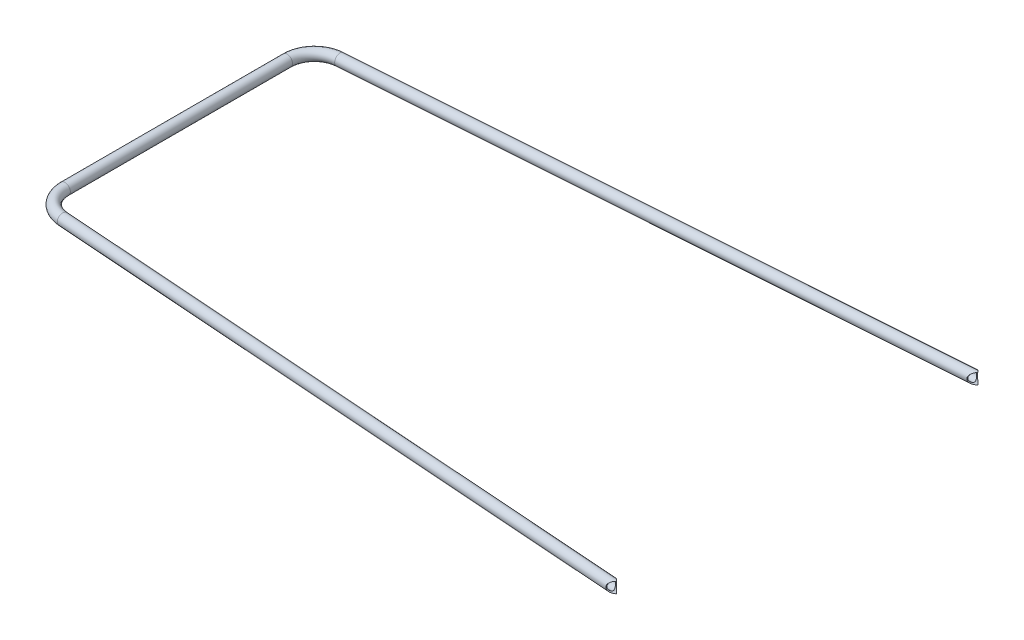
ISO-10303-21;
HEADER;
FILE_DESCRIPTION(('STEP AP214'),'2;1');
FILE_NAME('part.step','',(''),(''),'','','');
FILE_SCHEMA(('AUTOMOTIVE_DESIGN { 1 0 10303 214 1 1 1 1 }'));
ENDSEC;
DATA;
#1=APPLICATION_CONTEXT('core data for automotive mechanical design processes');
#2=APPLICATION_PROTOCOL_DEFINITION('international standard','automotive_design',2000,#1);
#3=PRODUCT_CONTEXT('',#1,'mechanical');
#4=PRODUCT('Part','Part','',(#3));
#5=PRODUCT_RELATED_PRODUCT_CATEGORY('part','',(#4));
#6=PRODUCT_DEFINITION_FORMATION('','',#4);
#7=PRODUCT_DEFINITION_CONTEXT('part definition',#1,'design');
#8=PRODUCT_DEFINITION('design','',#6,#7);
#9=PRODUCT_DEFINITION_SHAPE('','',#8);
#10=(LENGTH_UNIT() NAMED_UNIT(*) SI_UNIT(.MILLI.,.METRE.));
#11=(NAMED_UNIT(*) PLANE_ANGLE_UNIT() SI_UNIT($,.RADIAN.));
#12=(NAMED_UNIT(*) SI_UNIT($,.STERADIAN.) SOLID_ANGLE_UNIT());
#13=UNCERTAINTY_MEASURE_WITH_UNIT(LENGTH_MEASURE(1.E-05),#10,'distance_accuracy_value','');
#14=(GEOMETRIC_REPRESENTATION_CONTEXT(3) GLOBAL_UNCERTAINTY_ASSIGNED_CONTEXT((#13)) GLOBAL_UNIT_ASSIGNED_CONTEXT((#10,
#11,#12)) REPRESENTATION_CONTEXT('',''));
#15=CARTESIAN_POINT('',(0.,0.,0.));
#16=DIRECTION('',(0.,0.,1.));
#17=DIRECTION('',(1.,0.,0.));
#18=AXIS2_PLACEMENT_3D('',#15,#16,#17);
#19=CARTESIAN_POINT('',(37.150118000483,-3.03486438124222E-11,-202.653579857177));
#20=DIRECTION('',(0.997458699830736,0.,-0.0712470499879102));
#21=DIRECTION('',(-0.0712470499879102,0.,-0.997458699830736));
#22=AXIS2_PLACEMENT_3D('',#19,#20,#21);
#23=CYLINDRICAL_SURFACE('',#22,6.4375);
#24=CARTESIAN_POINT('',(902.062500000001,3.02324336860683E-11,-270.886937014753));
#25=CARTESIAN_POINT('',(902.062500072093,-0.157505178977726,-270.886936946997));
#26=CARTESIAN_POINT('',(902.067197131898,-0.315011322752131,-270.881468840321));
#27=CARTESIAN_POINT('',(902.085878644689,-0.628714091415458,-270.859688687306));
#28=CARTESIAN_POINT('',(902.099863208558,-0.784910700647427,-270.8433765115));
#29=CARTESIAN_POINT('',(902.136815761292,-1.09480606592514,-270.800167107787));
#30=CARTESIAN_POINT('',(902.15978699032,-1.24850390019056,-270.77326606202));
#31=CARTESIAN_POINT('',(902.214223198748,-1.5522223321391,-270.709293321239));
#32=CARTESIAN_POINT('',(902.245688270157,-1.70224288996958,-270.672221516053));
#33=CARTESIAN_POINT('',(902.31629901269,-1.99686363153447,-270.588645555399));
#34=CARTESIAN_POINT('',(902.355402872149,-2.14148843449494,-270.542192703229));
#35=CARTESIAN_POINT('',(902.440681711303,-2.42541215933582,-270.440300229725));
#36=CARTESIAN_POINT('',(902.486859477804,-2.56470895507041,-270.384857066099));
#37=CARTESIAN_POINT('',(902.634815711373,-2.97350977059825,-270.205967447341));
#38=CARTESIAN_POINT('',(902.746084696232,-3.23419722739244,-270.069882017558));
#39=CARTESIAN_POINT('',(902.997943955204,-3.75032380606122,-269.75524982281));
#40=CARTESIAN_POINT('',(903.140260781279,-4.00324001937486,-269.574005151556));
#41=CARTESIAN_POINT('',(903.43868339248,-4.47560927220908,-269.180930907685));
#42=CARTESIAN_POINT('',(903.594811046127,-4.69500768478237,-268.969052479464));
#43=CARTESIAN_POINT('',(903.848284175877,-5.01838881297674,-268.607237774687));
#44=CARTESIAN_POINT('',(903.944306637627,-5.1335650734022,-268.466189853585));
#45=CARTESIAN_POINT('',(904.135627858346,-5.3510743274456,-268.173895380536));
#46=CARTESIAN_POINT('',(904.230926339232,-5.45340259937063,-268.022645110389));
#47=CARTESIAN_POINT('',(904.417879996596,-5.64461647763952,-267.710020977684));
#48=CARTESIAN_POINT('',(904.509539428768,-5.73351814883801,-267.548659545617));
#49=CARTESIAN_POINT('',(904.685811037736,-5.89726744378057,-267.215464075232));
#50=CARTESIAN_POINT('',(904.770428312403,-5.9721252840715,-267.043637771341));
#51=CARTESIAN_POINT('',(904.943127459805,-6.11940307249689,-266.655762447322));
#52=CARTESIAN_POINT('',(905.028906290747,-6.18875813636219,-266.437446651094));
#53=CARTESIAN_POINT('',(905.138596517706,-6.27477829828204,-266.099552746765));
#54=CARTESIAN_POINT('',(905.171979496112,-6.30043746219807,-265.985271784427));
#55=CARTESIAN_POINT('',(905.23127005411,-6.34543165854436,-265.753592136232));
#56=CARTESIAN_POINT('',(905.257181581405,-6.3647700314268,-265.636195132746));
#57=CARTESIAN_POINT('',(905.300728381133,-6.39699164129169,-265.397549449936));
#58=CARTESIAN_POINT('',(905.318263934704,-6.40979721948817,-265.276271859266));
#59=CARTESIAN_POINT('',(905.343820419948,-6.42838631357086,-265.032182018241));
#60=CARTESIAN_POINT('',(905.351842094714,-6.43417037788063,-264.9093698885));
#61=CARTESIAN_POINT('',(905.358079891033,-6.43867217874907,-264.663343032984));
#62=CARTESIAN_POINT('',(905.356293933094,-6.43738841673078,-264.540128227367));
#63=CARTESIAN_POINT('',(905.343179388199,-6.42790709167013,-264.294478629085));
#64=CARTESIAN_POINT('',(905.33184962671,-6.41970867765838,-264.172043934296));
#65=CARTESIAN_POINT('',(905.29889917893,-6.39562433291054,-263.917427174118));
#66=CARTESIAN_POINT('',(905.276404623253,-6.37908322165822,-263.785421566653));
#67=CARTESIAN_POINT('',(905.222247024018,-6.33862115017849,-263.524403941276));
#68=CARTESIAN_POINT('',(905.190577479604,-6.31469495652643,-263.395394116254));
#69=CARTESIAN_POINT('',(905.1195382951,-6.25995289875943,-263.140674819758));
#70=CARTESIAN_POINT('',(905.08014943036,-6.2291198052937,-263.014974495717));
#71=CARTESIAN_POINT('',(904.995235213742,-6.16110356002377,-262.767495087909));
#72=CARTESIAN_POINT('',(904.949711158742,-6.12392174979263,-262.645715182151));
#73=CARTESIAN_POINT('',(904.826769774327,-6.02089240918181,-262.338337775821));
#74=CARTESIAN_POINT('',(904.745869401085,-5.95072100585987,-262.155574526596));
#75=CARTESIAN_POINT('',(904.57654567034,-5.79682363860701,-261.799463230797));
#76=CARTESIAN_POINT('',(904.488118101175,-5.71309006232002,-261.626120545326));
#77=CARTESIAN_POINT('',(904.306881325127,-5.53251295374564,-261.288416189492));
#78=CARTESIAN_POINT('',(904.214065667358,-5.43564970310403,-261.124068559431));
#79=CARTESIAN_POINT('',(904.026806766102,-5.22917771592109,-260.804636663527));
#80=CARTESIAN_POINT('',(903.932363843232,-5.11957146618606,-260.649550599193));
#81=CARTESIAN_POINT('',(903.739634487117,-4.88223079747909,-260.341839641262));
#82=CARTESIAN_POINT('',(903.641373715142,-4.75389013350001,-260.189665125901));
#83=CARTESIAN_POINT('',(903.447685933861,-4.48316807018542,-259.896306287203));
#84=CARTESIAN_POINT('',(903.352259417178,-4.34078424836657,-259.755123867576));
#85=CARTESIAN_POINT('',(903.166656381203,-4.04229358228335,-259.485165375022));
#86=CARTESIAN_POINT('',(903.07646754297,-3.8862213022862,-259.356359682352));
#87=CARTESIAN_POINT('',(902.903267047815,-3.56010550078461,-259.11220284161));
#88=CARTESIAN_POINT('',(902.820254767715,-3.39006319487776,-258.996850525006));
#89=CARTESIAN_POINT('',(902.686590445917,-3.0881520160178,-258.812945573091));
#90=CARTESIAN_POINT('',(902.633570573168,-2.95964787407935,-258.740567168604));
#91=CARTESIAN_POINT('',(902.533111020107,-2.69617125758341,-258.604226737008));
#92=CARTESIAN_POINT('',(902.485669873904,-2.56120049540387,-258.540262498425));
#93=CARTESIAN_POINT('',(902.397203956388,-2.28525402007962,-258.421539484548));
#94=CARTESIAN_POINT('',(902.356178019637,-2.14427940357723,-258.366779037085));
#95=CARTESIAN_POINT('',(902.281361594697,-1.8570248721414,-258.267273826564));
#96=CARTESIAN_POINT('',(902.24756810857,-1.71074718491247,-258.222524913255));
#97=CARTESIAN_POINT('',(902.187695751453,-1.41249077982161,-258.143448611352));
#98=CARTESIAN_POINT('',(902.161683203593,-1.2604748347982,-258.109210755318));
#99=CARTESIAN_POINT('',(902.118395442347,-0.953051226030533,-258.052330305459));
#100=CARTESIAN_POINT('',(902.101120219734,-0.797643565868518,-258.029687699387));
#101=CARTESIAN_POINT('',(902.075770963637,-0.484874436754648,-257.996487808059));
#102=CARTESIAN_POINT('',(902.067692136538,-0.327514028954344,-257.985924226607));
#103=CARTESIAN_POINT('',(902.060944279005,-0.0122549682938377,-257.977099772192));
#104=CARTESIAN_POINT('',(902.062274243872,0.145643625297541,-257.97883758565));
#105=CARTESIAN_POINT('',(902.073572926361,0.441415969220081,-257.993617136684));
#106=CARTESIAN_POINT('',(902.082478048325,0.579403295054776,-258.005267181034));
#107=CARTESIAN_POINT('',(902.10733867743,0.853680734847052,-258.037840321294));
#108=CARTESIAN_POINT('',(902.12329648704,0.989970279583004,-258.058766445544));
#109=CARTESIAN_POINT('',(902.161936879375,1.25985963873153,-258.109548511569));
#110=CARTESIAN_POINT('',(902.184617478237,1.39346023423718,-258.139401818998));
#111=CARTESIAN_POINT('',(902.236269826138,1.65725650805904,-258.2075886565));
#112=CARTESIAN_POINT('',(902.265243982868,1.7874508618512,-258.245925432153));
#113=CARTESIAN_POINT('',(902.362059548842,2.17669029720233,-258.374489241646));
#114=CARTESIAN_POINT('',(902.439061139621,2.42943144076257,-258.477316885249));
#115=CARTESIAN_POINT('',(902.612292381271,2.91412482942562,-258.711324696317));
#116=CARTESIAN_POINT('',(902.708530320373,3.14606805085528,-258.842517087098));
#117=CARTESIAN_POINT('',(902.889109368601,3.53161369569278,-259.092586963007));
#118=CARTESIAN_POINT('',(902.9703010468,3.69019069884707,-259.206183750008));
#119=CARTESIAN_POINT('',(903.138733987878,3.99464614604419,-259.445285580599));
#120=CARTESIAN_POINT('',(903.225975716248,4.14052361103057,-259.570791540758));
#121=CARTESIAN_POINT('',(903.404865105177,4.41992077583002,-259.832884980807));
#122=CARTESIAN_POINT('',(903.496524646693,4.55340396084735,-259.96950311026));
#123=CARTESIAN_POINT('',(903.682118243183,4.80760169346143,-260.252639779925));
#124=CARTESIAN_POINT('',(903.776051979434,4.92831801771885,-260.399156937906));
#125=CARTESIAN_POINT('',(903.966165281202,5.15941692616399,-260.704701735152));
#126=CARTESIAN_POINT('',(904.062351287917,5.26953577455749,-260.863924759221));
#127=CARTESIAN_POINT('',(904.25271300446,5.47652873853531,-261.191986047353));
#128=CARTESIAN_POINT('',(904.346888112847,5.57339893713025,-261.360827134205));
#129=CARTESIAN_POINT('',(904.530159323182,5.75336368066276,-261.707800203518));
#130=CARTESIAN_POINT('',(904.619266262505,5.83648840491534,-261.885910671806));
#131=CARTESIAN_POINT('',(904.788958281064,5.98848168775112,-262.251847665565));
#132=CARTESIAN_POINT('',(904.869549626292,6.05736076488375,-262.439666893377));
#133=CARTESIAN_POINT('',(905.028537632243,6.18874807456026,-262.853813518141));
#134=CARTESIAN_POINT('',(905.104883605052,6.24884519793685,-263.081751661891));
#135=CARTESIAN_POINT('',(905.199695926111,6.32159674980957,-263.432347362885));
#136=CARTESIAN_POINT('',(905.228005284465,6.34294117806163,-263.550592289575));
#137=CARTESIAN_POINT('',(905.276900483263,6.37943322813371,-263.789584511008));
#138=CARTESIAN_POINT('',(905.297490415344,6.39458413318057,-263.910330444188));
#139=CARTESIAN_POINT('',(905.330101274321,6.41844001035753,-264.155236617152));
#140=CARTESIAN_POINT('',(905.342007564294,6.42705880504458,-264.279420829532));
#141=CARTESIAN_POINT('',(905.356010994116,6.43718490721579,-264.528637698736));
#142=CARTESIAN_POINT('',(905.358108814758,6.43869270826602,-264.653670296071));
#143=CARTESIAN_POINT('',(905.352197566387,6.4344272503423,-264.903357840383));
#144=CARTESIAN_POINT('',(905.344190205921,6.42865522221571,-265.02801284763));
#145=CARTESIAN_POINT('',(905.318386946074,6.40988673537063,-265.27572317601));
#146=CARTESIAN_POINT('',(905.300591012796,6.39689025163331,-265.398778491602));
#147=CARTESIAN_POINT('',(905.239664819645,6.35180834522901,-265.731351742041));
#148=CARTESIAN_POINT('',(905.187524583498,6.31271372696505,-265.938322852191));
#149=CARTESIAN_POINT('',(905.062543495132,6.21543267475606,-266.341178209147));
#150=CARTESIAN_POINT('',(904.989675392838,6.15722109285492,-266.53704745155));
#151=CARTESIAN_POINT('',(904.841386492844,6.03328917054349,-266.889370426286));
#152=CARTESIAN_POINT('',(904.767837295195,5.96984996619212,-267.047443475123));
#153=CARTESIAN_POINT('',(904.613827205419,5.83127609181235,-267.35494190731));
#154=CARTESIAN_POINT('',(904.533362052898,5.75613418916418,-267.504361863915));
#155=CARTESIAN_POINT('',(904.368184949671,5.59463521911482,-267.795022089262));
#156=CARTESIAN_POINT('',(904.283464236468,5.50825437575812,-267.936244072318));
#157=CARTESIAN_POINT('',(904.11221745274,5.32481635921765,-268.21034694926));
#158=CARTESIAN_POINT('',(904.025691724998,5.22776119847084,-268.343229408008));
#159=CARTESIAN_POINT('',(903.848923343142,5.0187357480292,-268.606364610143));
#160=CARTESIAN_POINT('',(903.758683422212,4.9062991370952,-268.736248946498));
#161=CARTESIAN_POINT('',(903.580103297694,4.6701983063791,-268.986902080791));
#162=CARTESIAN_POINT('',(903.491763721339,4.54653044782308,-269.107667901077));
#163=CARTESIAN_POINT('',(903.318829678179,4.2883537376251,-269.339478071192));
#164=CARTESIAN_POINT('',(903.234230043522,4.1538606190245,-269.450536056952));
#165=CARTESIAN_POINT('',(903.070257306549,3.87412532139261,-269.662495938915));
#166=CARTESIAN_POINT('',(902.990883223543,3.72888517020898,-269.763399742665));
#167=CARTESIAN_POINT('',(902.848676797627,3.44732767767236,-269.94200240948));
#168=CARTESIAN_POINT('',(902.785028785584,3.3122568262088,-270.021017452195));
#169=CARTESIAN_POINT('',(902.66394037484,3.03464214223892,-270.170060207134));
#170=CARTESIAN_POINT('',(902.606497348822,2.89210151085926,-270.240091725539));
#171=CARTESIAN_POINT('',(902.498821915079,2.60008482870335,-270.37047717185));
#172=CARTESIAN_POINT('',(902.448587149117,2.45061106742852,-270.430834265579));
#173=CARTESIAN_POINT('',(902.356280063154,2.14542685291231,-270.541163252044));
#174=CARTESIAN_POINT('',(902.314207154956,1.98971685007269,-270.591135893173));
#175=CARTESIAN_POINT('',(902.24195585326,1.68501785816856,-270.676624262355));
#176=CARTESIAN_POINT('',(902.211118265614,1.53641201022404,-270.712947858543));
#177=CARTESIAN_POINT('',(902.157781242092,1.23564902847202,-270.775616952843));
#178=CARTESIAN_POINT('',(902.135280686807,1.08349237434792,-270.80196379054));
#179=CARTESIAN_POINT('',(902.099088076839,0.776748667788487,-270.844281089987));
#180=CARTESIAN_POINT('',(902.085393335105,0.622162371510732,-270.860254717085));
#181=CARTESIAN_POINT('',(902.067099195506,0.311717710596555,-270.881582789479));
#182=CARTESIAN_POINT('',(902.062499928663,0.155859327667956,-270.886937081802));
#183=CARTESIAN_POINT('',(902.062500000001,3.02324336860683E-11,-270.886937014753));
#184=B_SPLINE_CURVE_WITH_KNOTS('',3,(#24,#25,#26,#27,#28,#29,#30,#31,#32,#33,#34,#35,#36,#37,
#38,#39,#40,#41,#42,#43,#44,#45,#46,#47,#48,#49,#50,#51,#52,#53,#54,#55,#56,#57,#58,#59,#60,#61,
#62,#63,#64,#65,#66,#67,#68,#69,#70,#71,#72,#73,#74,#75,#76,#77,#78,#79,#80,#81,#82,#83,#84,#85,
#86,#87,#88,#89,#90,#91,#92,#93,#94,#95,#96,#97,#98,#99,#100,#101,#102,#103,#104,#105,#106,#107,
#108,#109,#110,#111,#112,#113,#114,#115,#116,#117,#118,#119,#120,#121,#122,#123,#124,#125,#126,
#127,#128,#129,#130,#131,#132,#133,#134,#135,#136,#137,#138,#139,#140,#141,#142,#143,#144,#145,
#146,#147,#148,#149,#150,#151,#152,#153,#154,#155,#156,#157,#158,#159,#160,#161,#162,#163,#164,
#165,#166,#167,#168,#169,#170,#171,#172,#173,#174,#175,#176,#177,#178,#179,#180,#181,#182,#183),
.UNSPECIFIED.,.T.,.F.,(4,2,2,2,2,2,2,2,2,2,2,2,2,2,2,2,2,2,2,2,2,2,2,2,2,2,2,2,2,2,2,2,2,2,2,2,
2,2,2,2,2,2,2,2,2,2,2,2,2,2,2,2,2,2,2,2,2,2,2,2,2,2,2,2,2,2,2,2,2,2,2,2,2,2,2,2,2,2,2,4),(0.,
0.472353873402621,0.94471338629413,1.41724336661991,1.88977846574643,2.35979612115191,
2.82999942123645,3.76953941845855,4.79253282221384,5.81717610000756,6.43421363532453,
7.05147727503858,7.66799640920811,8.28406528658488,9.01516270292666,9.38017995145539,
9.74500398023915,10.114069322494,10.4831058366133,10.8522205998137,11.2213807956988,
11.625542398541,12.0299910698621,12.4354601063325,12.8408435672973,13.475356558786,
14.1102269402683,14.7460615681093,15.3817723199477,16.0470661657624,16.7124749779892,
17.3762494689402,18.039966262805,18.5097379255396,18.9793858717222,19.4489483985715,
19.9183159074789,20.3915771130107,20.8648378187212,21.3378517245098,21.8108151212144,
22.226611463077,22.6425436490291,23.0583532173595,23.4743221407,24.3214007464564,
25.168845116839,25.8019036870619,26.4350110190748,27.0699279998968,27.7047565078763,
28.352647283495,29.0007291971197,29.6473687373581,30.2935291006362,31.0343393133877,
31.4043318072023,31.7741279104543,32.1487216206454,32.5232893303264,32.8977937179341,
33.2722994024867,33.9205488538693,34.5696545024417,35.1254816249586,35.6816536386219,
36.2390219682148,36.796285396292,37.3778904426906,37.959684598177,38.5406479556774,
39.1215019699106,39.6278220823535,40.1339269612021,40.6398658845417,41.145768332981,
41.6133851574944,42.0809391725534,42.5483504480505,43.0157684566475),.UNSPECIFIED.);
#185=CARTESIAN_POINT('',(902.062500000001,3.02324336860683E-11,-270.886937014753));
#186=VERTEX_POINT('',#185);
#187=EDGE_CURVE('E75',#186,#186,#184,.T.);
#188=ORIENTED_EDGE('',*,*,#187,.F.);
#189=EDGE_LOOP('',(#188));
#190=FACE_BOUND('',#189,.T.);
#191=CARTESIAN_POINT('',(37.1501180004829,-3.03486389684526E-11,-202.653579857177));
#192=DIRECTION('',(-0.997458699830736,0.,0.0712470499879106));
#193=DIRECTION('',(0.0712470499879107,0.,0.997458699830736));
#194=AXIS2_PLACEMENT_3D('',#191,#192,#193);
#195=CIRCLE('',#194,6.4375);
#196=CARTESIAN_POINT('',(37.6087708847801,-3.03486389684526E-11,-196.232439477017));
#197=VERTEX_POINT('',#196);
#198=EDGE_CURVE('E57',#197,#197,#195,.T.);
#199=ORIENTED_EDGE('',*,*,#198,.T.);
#200=EDGE_LOOP('',(#199));
#201=FACE_BOUND('',#200,.T.);
#202=ADVANCED_FACE('F53',(#190,#201),#23,.F.);
#203=CARTESIAN_POINT('',(37.150118000483,-3.03486438124222E-11,-202.653579857177));
#204=DIRECTION('',(0.997458699830736,0.,-0.0712470499879102));
#205=DIRECTION('',(-0.0712470499879102,0.,-0.997458699830736));
#206=AXIS2_PLACEMENT_3D('',#203,#204,#205);
#207=CYLINDRICAL_SURFACE('',#206,7.9375);
#208=CARTESIAN_POINT('',(910.000000000001,3.07559559516459E-11,-265.));
#209=DIRECTION('',(0.681451740775563,0.,-0.731863050709596));
#210=DIRECTION('',(0.731863050709595,0.,0.681451740775563));
#211=AXIS2_PLACEMENT_3D('',#208,#209,#210);
#212=ELLIPSE('',#211,10.8456083310997,7.93749999999999);
#213=CARTESIAN_POINT('',(910.,7.93750000003074,-265.));
#214=VERTEX_POINT('',#213);
#215=CARTESIAN_POINT('',(910.000000000001,-7.93749999996924,-265.));
#216=VERTEX_POINT('',#215);
#217=EDGE_CURVE('E69',#214,#216,#212,.F.);
#218=ORIENTED_EDGE('',*,*,#217,.T.);
#219=CARTESIAN_POINT('',(910.000000000001,3.07559559516459E-11,-265.));
#220=DIRECTION('',(0.731863050709595,0.,0.681451740775563));
#221=DIRECTION('',(0.681451740775563,0.,-0.731863050709596));
#222=AXIS2_PLACEMENT_3D('',#219,#220,#221);
#223=ELLIPSE('',#222,11.6479268083845,7.93749999999999);
#224=EDGE_CURVE('E67',#216,#214,#223,.F.);
#225=ORIENTED_EDGE('',*,*,#224,.T.);
#226=EDGE_LOOP('',(#218,#225));
#227=FACE_BOUND('',#226,.T.);
#228=CARTESIAN_POINT('',(37.1501180004829,-3.03486389684526E-11,-202.653579857177));
#229=DIRECTION('',(-0.997458699830736,0.,0.0712470499879106));
#230=DIRECTION('',(0.0712470499879107,0.,0.997458699830736));
#231=AXIS2_PLACEMENT_3D('',#228,#229,#230);
#232=CIRCLE('',#231,7.9375);
#233=CARTESIAN_POINT('',(37.7156414597619,-3.03486389684526E-11,-194.736251427271));
#234=VERTEX_POINT('',#233);
#235=EDGE_CURVE('E13',#234,#234,#232,.T.);
#236=ORIENTED_EDGE('',*,*,#235,.F.);
#237=EDGE_LOOP('',(#236));
#238=FACE_BOUND('',#237,.T.);
#239=ADVANCED_FACE('F73',(#227,#238),#207,.T.);
#240=CARTESIAN_POINT('',(37.1501180004829,-3.03486389684526E-11,-202.653579857177));
#241=DIRECTION('',(-0.997458699830736,0.,0.0712470499879106));
#242=DIRECTION('',(0.0712470499879107,0.,0.997458699830736));
#243=AXIS2_PLACEMENT_3D('',#240,#241,#242);
#244=PLANE('',#243);
#245=ORIENTED_EDGE('',*,*,#198,.F.);
#246=EDGE_LOOP('',(#245));
#247=FACE_BOUND('',#246,.T.);
#248=ORIENTED_EDGE('',*,*,#235,.T.);
#249=EDGE_LOOP('',(#248));
#250=FACE_BOUND('',#249,.T.);
#251=ADVANCED_FACE('F55',(#247,#250),#244,.T.);
#252=CARTESIAN_POINT('',(910.,3.0795331125232E-11,-272.917328429907));
#253=DIRECTION('',(0.,0.,1.));
#254=DIRECTION('',(1.,0.,0.));
#255=AXIS2_PLACEMENT_3D('',#252,#253,#254);
#256=CYLINDRICAL_SURFACE('',#255,7.93749999999998);
#257=ORIENTED_EDGE('',*,*,#187,.T.);
#258=EDGE_LOOP('',(#257));
#259=FACE_BOUND('',#258,.T.);
#260=ORIENTED_EDGE('',*,*,#217,.F.);
#261=ORIENTED_EDGE('',*,*,#224,.F.);
#262=EDGE_LOOP('',(#260,#261));
#263=FACE_BOUND('',#262,.T.);
#264=ADVANCED_FACE('F70',(#259,#263),#256,.F.);
#265=CLOSED_SHELL('',(#202,#239,#251,#264));
#266=MANIFOLD_SOLID_BREP('B2',#265);
#267=CARTESIAN_POINT('',(40.,0.,-162.755231863948));
#268=DIRECTION('',(0.,-1.,0.));
#269=DIRECTION('',(0.,0.,-1.));
#270=AXIS2_PLACEMENT_3D('',#267,#268,#269);
#271=TOROIDAL_SURFACE('',#270,40.,6.4375);
#272=CARTESIAN_POINT('',(0.,0.,-162.755231863948));
#273=DIRECTION('',(0.,0.,1.));
#274=DIRECTION('',(1.,0.,0.));
#275=AXIS2_PLACEMENT_3D('',#272,#273,#274);
#276=CIRCLE('',#275,6.4375);
#277=CARTESIAN_POINT('',(-6.43749999999997,0.,-162.755231863948));
#278=VERTEX_POINT('',#277);
#279=EDGE_CURVE('E160',#278,#278,#276,.T.);
#280=CARTESIAN_POINT('',(37.1501180004836,0.,-202.653579857177));
#281=DIRECTION('',(0.997458699830736,0.,-0.07124704998791));
#282=DIRECTION('',(-0.07124704998791,0.,-0.997458699830736));
#283=AXIS2_PLACEMENT_3D('',#280,#281,#282);
#284=CIRCLE('',#283,6.4375);
#285=CARTESIAN_POINT('',(36.6914651161865,0.,-209.074720237338));
#286=VERTEX_POINT('',#285);
#287=EDGE_CURVE('E150',#286,#286,#284,.T.);
#288=CARTESIAN_POINT('',(40.,0.,-162.755231863948));
#289=DIRECTION('',(0.,-1.,0.));
#290=DIRECTION('',(0.,0.,-1.));
#291=AXIS2_PLACEMENT_3D('',#288,#289,#290);
#292=CIRCLE('',#291,46.4375);
#293=EDGE_CURVE('',#278,#286,#292,.T.);
#294=ORIENTED_EDGE('',*,*,#279,.T.);
#295=ORIENTED_EDGE('',*,*,#287,.T.);
#296=ORIENTED_EDGE('',*,*,#293,.T.);
#297=ORIENTED_EDGE('',*,*,#293,.F.);
#298=EDGE_LOOP('',(#294,#296,#295,#297));
#299=FACE_BOUND('',#298,.T.);
#300=ADVANCED_FACE('F146',(#299),#271,.F.);
#301=CARTESIAN_POINT('',(40.,0.,-162.755231863948));
#302=DIRECTION('',(0.,-1.,0.));
#303=DIRECTION('',(0.,0.,-1.));
#304=AXIS2_PLACEMENT_3D('',#301,#302,#303);
#305=TOROIDAL_SURFACE('',#304,40.,7.9375);
#306=CARTESIAN_POINT('',(0.,0.,-162.755231863948));
#307=DIRECTION('',(0.,0.,1.));
#308=DIRECTION('',(1.,0.,0.));
#309=AXIS2_PLACEMENT_3D('',#306,#307,#308);
#310=CIRCLE('',#309,7.9375);
#311=CARTESIAN_POINT('',(-7.93749999999997,0.,-162.755231863948));
#312=VERTEX_POINT('',#311);
#313=EDGE_CURVE('E154',#312,#312,#310,.T.);
#314=CARTESIAN_POINT('',(37.1501180004836,0.,-202.653579857177));
#315=DIRECTION('',(0.997458699830736,0.,-0.07124704998791));
#316=DIRECTION('',(-0.07124704998791,0.,-0.997458699830736));
#317=AXIS2_PLACEMENT_3D('',#314,#315,#316);
#318=CIRCLE('',#317,7.9375);
#319=CARTESIAN_POINT('',(36.5845945412046,0.,-210.570908287084));
#320=VERTEX_POINT('',#319);
#321=EDGE_CURVE('E52',#320,#320,#318,.T.);
#322=CARTESIAN_POINT('',(40.,0.,-162.755231863948));
#323=DIRECTION('',(0.,-1.,0.));
#324=DIRECTION('',(0.,0.,-1.));
#325=AXIS2_PLACEMENT_3D('',#322,#323,#324);
#326=CIRCLE('',#325,47.9375);
#327=EDGE_CURVE('',#312,#320,#326,.T.);
#328=ORIENTED_EDGE('',*,*,#313,.F.);
#329=ORIENTED_EDGE('',*,*,#321,.F.);
#330=ORIENTED_EDGE('',*,*,#327,.T.);
#331=ORIENTED_EDGE('',*,*,#327,.F.);
#332=EDGE_LOOP('',(#328,#330,#329,#331));
#333=FACE_BOUND('',#332,.T.);
#334=ADVANCED_FACE('F173',(#333),#305,.T.);
#335=CARTESIAN_POINT('',(0.,0.,-162.755231863948));
#336=DIRECTION('',(0.,0.,1.));
#337=DIRECTION('',(1.,0.,0.));
#338=AXIS2_PLACEMENT_3D('',#335,#336,#337);
#339=PLANE('',#338);
#340=ORIENTED_EDGE('',*,*,#279,.F.);
#341=EDGE_LOOP('',(#340));
#342=FACE_BOUND('',#341,.T.);
#343=ORIENTED_EDGE('',*,*,#313,.T.);
#344=EDGE_LOOP('',(#343));
#345=FACE_BOUND('',#344,.T.);
#346=ADVANCED_FACE('F169',(#342,#345),#339,.T.);
#347=CARTESIAN_POINT('',(37.1501180004837,0.,-202.653579857177));
#348=DIRECTION('',(0.997458699830736,0.,-0.07124704998791));
#349=DIRECTION('',(-0.07124704998791,0.,-0.997458699830736));
#350=AXIS2_PLACEMENT_3D('',#347,#348,#349);
#351=PLANE('',#350);
#352=ORIENTED_EDGE('',*,*,#287,.F.);
#353=EDGE_LOOP('',(#352));
#354=FACE_BOUND('',#353,.T.);
#355=ORIENTED_EDGE('',*,*,#321,.T.);
#356=EDGE_LOOP('',(#355));
#357=FACE_BOUND('',#356,.T.);
#358=ADVANCED_FACE('F148',(#354,#357),#351,.T.);
#359=CLOSED_SHELL('',(#300,#334,#346,#358));
#360=MANIFOLD_SOLID_BREP('B7',#359);
#361=CARTESIAN_POINT('',(0.,0.,162.755231863948));
#362=DIRECTION('',(0.,0.,-1.));
#363=DIRECTION('',(-1.,0.,0.));
#364=AXIS2_PLACEMENT_3D('',#361,#362,#363);
#365=CYLINDRICAL_SURFACE('',#364,6.4375);
#366=CARTESIAN_POINT('',(0.,0.,162.755231863948));
#367=DIRECTION('',(0.,0.,1.));
#368=DIRECTION('',(1.,0.,0.));
#369=AXIS2_PLACEMENT_3D('',#366,#367,#368);
#370=CIRCLE('',#369,6.4375);
#371=CARTESIAN_POINT('',(6.43749999999998,0.,162.755231863948));
#372=VERTEX_POINT('',#371);
#373=EDGE_CURVE('E245',#372,#372,#370,.T.);
#374=ORIENTED_EDGE('',*,*,#373,.T.);
#375=EDGE_LOOP('',(#374));
#376=FACE_BOUND('',#375,.T.);
#377=CARTESIAN_POINT('',(0.,0.,-162.755231863948));
#378=DIRECTION('',(0.,0.,-1.));
#379=DIRECTION('',(-1.,0.,0.));
#380=AXIS2_PLACEMENT_3D('',#377,#378,#379);
#381=CIRCLE('',#380,6.4375);
#382=CARTESIAN_POINT('',(-6.43750000000003,0.,-162.755231863948));
#383=VERTEX_POINT('',#382);
#384=EDGE_CURVE('E235',#383,#383,#381,.T.);
#385=ORIENTED_EDGE('',*,*,#384,.T.);
#386=EDGE_LOOP('',(#385));
#387=FACE_BOUND('',#386,.T.);
#388=ADVANCED_FACE('F231',(#376,#387),#365,.F.);
#389=CARTESIAN_POINT('',(0.,0.,162.755231863948));
#390=DIRECTION('',(0.,0.,-1.));
#391=DIRECTION('',(-1.,0.,0.));
#392=AXIS2_PLACEMENT_3D('',#389,#390,#391);
#393=CYLINDRICAL_SURFACE('',#392,7.9375);
#394=CARTESIAN_POINT('',(0.,0.,162.755231863948));
#395=DIRECTION('',(0.,0.,1.));
#396=DIRECTION('',(1.,0.,0.));
#397=AXIS2_PLACEMENT_3D('',#394,#395,#396);
#398=CIRCLE('',#397,7.9375);
#399=CARTESIAN_POINT('',(7.93749999999997,0.,162.755231863948));
#400=VERTEX_POINT('',#399);
#401=EDGE_CURVE('E239',#400,#400,#398,.T.);
#402=ORIENTED_EDGE('',*,*,#401,.F.);
#403=EDGE_LOOP('',(#402));
#404=FACE_BOUND('',#403,.T.);
#405=CARTESIAN_POINT('',(0.,0.,-162.755231863948));
#406=DIRECTION('',(0.,0.,-1.));
#407=DIRECTION('',(-1.,0.,0.));
#408=AXIS2_PLACEMENT_3D('',#405,#406,#407);
#409=CIRCLE('',#408,7.9375);
#410=CARTESIAN_POINT('',(-7.93750000000003,0.,-162.755231863948));
#411=VERTEX_POINT('',#410);
#412=EDGE_CURVE('E145',#411,#411,#409,.T.);
#413=ORIENTED_EDGE('',*,*,#412,.F.);
#414=EDGE_LOOP('',(#413));
#415=FACE_BOUND('',#414,.T.);
#416=ADVANCED_FACE('F258',(#404,#415),#393,.T.);
#417=CARTESIAN_POINT('',(0.,0.,162.755231863948));
#418=DIRECTION('',(0.,0.,1.));
#419=DIRECTION('',(1.,0.,0.));
#420=AXIS2_PLACEMENT_3D('',#417,#418,#419);
#421=PLANE('',#420);
#422=ORIENTED_EDGE('',*,*,#373,.F.);
#423=EDGE_LOOP('',(#422));
#424=FACE_BOUND('',#423,.T.);
#425=ORIENTED_EDGE('',*,*,#401,.T.);
#426=EDGE_LOOP('',(#425));
#427=FACE_BOUND('',#426,.T.);
#428=ADVANCED_FACE('F254',(#424,#427),#421,.T.);
#429=CARTESIAN_POINT('',(0.,0.,-162.755231863948));
#430=DIRECTION('',(0.,0.,-1.));
#431=DIRECTION('',(-1.,0.,0.));
#432=AXIS2_PLACEMENT_3D('',#429,#430,#431);
#433=PLANE('',#432);
#434=ORIENTED_EDGE('',*,*,#384,.F.);
#435=EDGE_LOOP('',(#434));
#436=FACE_BOUND('',#435,.T.);
#437=ORIENTED_EDGE('',*,*,#412,.T.);
#438=EDGE_LOOP('',(#437));
#439=FACE_BOUND('',#438,.T.);
#440=ADVANCED_FACE('F233',(#436,#439),#433,.T.);
#441=CLOSED_SHELL('',(#388,#416,#428,#440));
#442=MANIFOLD_SOLID_BREP('B47',#441);
#443=CARTESIAN_POINT('',(40.0000000000001,0.,162.755231863948));
#444=DIRECTION('',(0.,-1.,0.));
#445=DIRECTION('',(0.,0.,-1.));
#446=AXIS2_PLACEMENT_3D('',#443,#444,#445);
#447=TOROIDAL_SURFACE('',#446,40.,6.4375);
#448=CARTESIAN_POINT('',(37.1501180004837,0.,202.653579857177));
#449=DIRECTION('',(0.997458699830736,0.,0.0712470499879095));
#450=DIRECTION('',(0.0712470499879098,0.,-0.997458699830736));
#451=AXIS2_PLACEMENT_3D('',#448,#449,#450);
#452=CIRCLE('',#451,6.4375);
#453=CARTESIAN_POINT('',(36.6914651161865,0.,209.074720237338));
#454=VERTEX_POINT('',#453);
#455=EDGE_CURVE('E342',#454,#454,#452,.T.);
#456=CARTESIAN_POINT('',(0.,0.,162.755231863948));
#457=DIRECTION('',(0.,0.,-1.));
#458=DIRECTION('',(-1.,0.,0.));
#459=AXIS2_PLACEMENT_3D('',#456,#457,#458);
#460=CIRCLE('',#459,6.4375);
#461=CARTESIAN_POINT('',(-6.43749999999999,0.,162.755231863948));
#462=VERTEX_POINT('',#461);
#463=EDGE_CURVE('E332',#462,#462,#460,.T.);
#464=CARTESIAN_POINT('',(40.0000000000001,0.,162.755231863948));
#465=DIRECTION('',(0.,-1.,0.));
#466=DIRECTION('',(0.,0.,-1.));
#467=AXIS2_PLACEMENT_3D('',#464,#465,#466);
#468=CIRCLE('',#467,46.4375000000001);
#469=EDGE_CURVE('',#454,#462,#468,.T.);
#470=ORIENTED_EDGE('',*,*,#455,.T.);
#471=ORIENTED_EDGE('',*,*,#463,.T.);
#472=ORIENTED_EDGE('',*,*,#469,.T.);
#473=ORIENTED_EDGE('',*,*,#469,.F.);
#474=EDGE_LOOP('',(#470,#472,#471,#473));
#475=FACE_BOUND('',#474,.T.);
#476=ADVANCED_FACE('F328',(#475),#447,.F.);
#477=CARTESIAN_POINT('',(40.0000000000001,0.,162.755231863948));
#478=DIRECTION('',(0.,-1.,0.));
#479=DIRECTION('',(0.,0.,-1.));
#480=AXIS2_PLACEMENT_3D('',#477,#478,#479);
#481=TOROIDAL_SURFACE('',#480,40.,7.9375);
#482=CARTESIAN_POINT('',(37.1501180004837,0.,202.653579857177));
#483=DIRECTION('',(0.997458699830736,0.,0.0712470499879095));
#484=DIRECTION('',(0.0712470499879098,0.,-0.997458699830736));
#485=AXIS2_PLACEMENT_3D('',#482,#483,#484);
#486=CIRCLE('',#485,7.9375);
#487=CARTESIAN_POINT('',(36.5845945412046,0.,210.570908287084));
#488=VERTEX_POINT('',#487);
#489=EDGE_CURVE('E336',#488,#488,#486,.T.);
#490=CARTESIAN_POINT('',(0.,0.,162.755231863948));
#491=DIRECTION('',(0.,0.,-1.));
#492=DIRECTION('',(-1.,0.,0.));
#493=AXIS2_PLACEMENT_3D('',#490,#491,#492);
#494=CIRCLE('',#493,7.9375);
#495=CARTESIAN_POINT('',(-7.93749999999999,0.,162.755231863948));
#496=VERTEX_POINT('',#495);
#497=EDGE_CURVE('E230',#496,#496,#494,.T.);
#498=CARTESIAN_POINT('',(40.0000000000001,0.,162.755231863948));
#499=DIRECTION('',(0.,-1.,0.));
#500=DIRECTION('',(0.,0.,-1.));
#501=AXIS2_PLACEMENT_3D('',#498,#499,#500);
#502=CIRCLE('',#501,47.9375);
#503=EDGE_CURVE('',#488,#496,#502,.T.);
#504=ORIENTED_EDGE('',*,*,#489,.F.);
#505=ORIENTED_EDGE('',*,*,#497,.F.);
#506=ORIENTED_EDGE('',*,*,#503,.T.);
#507=ORIENTED_EDGE('',*,*,#503,.F.);
#508=EDGE_LOOP('',(#504,#506,#505,#507));
#509=FACE_BOUND('',#508,.T.);
#510=ADVANCED_FACE('F355',(#509),#481,.T.);
#511=CARTESIAN_POINT('',(37.1501180004837,0.,202.653579857177));
#512=DIRECTION('',(0.997458699830736,0.,0.0712470499879095));
#513=DIRECTION('',(0.0712470499879098,0.,-0.997458699830736));
#514=AXIS2_PLACEMENT_3D('',#511,#512,#513);
#515=PLANE('',#514);
#516=ORIENTED_EDGE('',*,*,#455,.F.);
#517=EDGE_LOOP('',(#516));
#518=FACE_BOUND('',#517,.T.);
#519=ORIENTED_EDGE('',*,*,#489,.T.);
#520=EDGE_LOOP('',(#519));
#521=FACE_BOUND('',#520,.T.);
#522=ADVANCED_FACE('F351',(#518,#521),#515,.T.);
#523=CARTESIAN_POINT('',(0.,0.,162.755231863948));
#524=DIRECTION('',(0.,0.,-1.));
#525=DIRECTION('',(-1.,0.,0.));
#526=AXIS2_PLACEMENT_3D('',#523,#524,#525);
#527=PLANE('',#526);
#528=ORIENTED_EDGE('',*,*,#463,.F.);
#529=EDGE_LOOP('',(#528));
#530=FACE_BOUND('',#529,.T.);
#531=ORIENTED_EDGE('',*,*,#497,.T.);
#532=EDGE_LOOP('',(#531));
#533=FACE_BOUND('',#532,.T.);
#534=ADVANCED_FACE('F330',(#530,#533),#527,.T.);
#535=CLOSED_SHELL('',(#476,#510,#522,#534));
#536=MANIFOLD_SOLID_BREP('B140',#535);
#537=CARTESIAN_POINT('',(910.,0.,265.));
#538=DIRECTION('',(-0.997458699830736,0.,-0.0712470499879097));
#539=DIRECTION('',(-0.0712470499879096,0.,0.997458699830736));
#540=AXIS2_PLACEMENT_3D('',#537,#538,#539);
#541=CYLINDRICAL_SURFACE('',#540,6.4375);
#542=CARTESIAN_POINT('',(902.0625,0.,270.886937014753));
#543=CARTESIAN_POINT('',(902.062500072092,0.157505179007947,270.886936946997));
#544=CARTESIAN_POINT('',(902.067197131898,0.31501132278234,270.881468840321));
#545=CARTESIAN_POINT('',(902.08587864469,0.628714091445654,270.859688687306));
#546=CARTESIAN_POINT('',(902.099863208558,0.784910700677623,270.8433765115));
#547=CARTESIAN_POINT('',(902.136815761292,1.09480606595535,270.800167107787));
#548=CARTESIAN_POINT('',(902.15978699032,1.24850390022079,270.77326606202));
#549=CARTESIAN_POINT('',(902.214223198748,1.55222233216933,270.709293321239));
#550=CARTESIAN_POINT('',(902.245688270157,1.7022428899998,270.672221516052));
#551=CARTESIAN_POINT('',(902.31629901269,1.99686363156471,270.588645555399));
#552=CARTESIAN_POINT('',(902.355402872149,2.14148843452521,270.542192703229));
#553=CARTESIAN_POINT('',(902.440681711303,2.42541215936612,270.440300229725));
#554=CARTESIAN_POINT('',(902.486859477804,2.56470895510072,270.384857066099));
#555=CARTESIAN_POINT('',(902.634815711373,2.97350977062854,270.205967447341));
#556=CARTESIAN_POINT('',(902.746084696232,3.23419722742265,270.069882017557));
#557=CARTESIAN_POINT('',(902.997943955204,3.75032380609135,269.75524982281));
#558=CARTESIAN_POINT('',(903.14026078128,4.00324001940501,269.574005151556));
#559=CARTESIAN_POINT('',(903.438683392479,4.47560927223935,269.180930907685));
#560=CARTESIAN_POINT('',(903.594811046125,4.69500768481276,268.969052479463));
#561=CARTESIAN_POINT('',(903.848284175876,5.01838881300699,268.607237774686));
#562=CARTESIAN_POINT('',(903.944306637626,5.13356507343233,268.466189853585));
#563=CARTESIAN_POINT('',(904.135627858346,5.35107432747568,268.173895380537));
#564=CARTESIAN_POINT('',(904.230926339231,5.45340259940078,268.022645110389));
#565=CARTESIAN_POINT('',(904.417879996596,5.64461647766973,267.710020977684));
#566=CARTESIAN_POINT('',(904.509539428768,5.73351814886819,267.548659545618));
#567=CARTESIAN_POINT('',(904.685811037736,5.89726744381082,267.215464075232));
#568=CARTESIAN_POINT('',(904.770428312402,5.97212528410185,267.043637771341));
#569=CARTESIAN_POINT('',(904.943127459804,6.11940307252731,266.655762447322));
#570=CARTESIAN_POINT('',(905.028906290747,6.18875813639259,266.437446651094));
#571=CARTESIAN_POINT('',(905.138596517706,6.27477829831242,266.099552746765));
#572=CARTESIAN_POINT('',(905.171979496112,6.30043746222846,265.985271784427));
#573=CARTESIAN_POINT('',(905.231270054109,6.34543165857477,265.753592136232));
#574=CARTESIAN_POINT('',(905.257181581404,6.36477003145722,265.636195132745));
#575=CARTESIAN_POINT('',(905.300728381132,6.39699164132212,265.397549449936));
#576=CARTESIAN_POINT('',(905.318263934703,6.4097972195186,265.276271859266));
#577=CARTESIAN_POINT('',(905.343820419948,6.42838631360129,265.032182018241));
#578=CARTESIAN_POINT('',(905.351842094713,6.43417037791106,264.9093698885));
#579=CARTESIAN_POINT('',(905.358079891033,6.4386721787795,264.663343032984));
#580=CARTESIAN_POINT('',(905.356293933094,6.43738841676121,264.540128227366));
#581=CARTESIAN_POINT('',(905.343179388199,6.42790709170055,264.294478629085));
#582=CARTESIAN_POINT('',(905.33184962671,6.41970867768881,264.172043934296));
#583=CARTESIAN_POINT('',(905.29889917893,6.39562433294097,263.917427174118));
#584=CARTESIAN_POINT('',(905.276404623252,6.37908322168864,263.785421566652));
#585=CARTESIAN_POINT('',(905.222247024018,6.33862115020889,263.524403941276));
#586=CARTESIAN_POINT('',(905.190577479603,6.31469495655682,263.395394116253));
#587=CARTESIAN_POINT('',(905.1195382951,6.2599528987898,263.140674819757));
#588=CARTESIAN_POINT('',(905.08014943036,6.22911980532404,263.014974495717));
#589=CARTESIAN_POINT('',(904.995235213741,6.16110356005412,262.767495087909));
#590=CARTESIAN_POINT('',(904.949711158742,6.12392174982299,262.645715182151));
#591=CARTESIAN_POINT('',(904.826769774327,6.02089240921217,262.338337775821));
#592=CARTESIAN_POINT('',(904.745869401084,5.95072100589018,262.155574526596));
#593=CARTESIAN_POINT('',(904.576545670339,5.79682363863727,261.799463230797));
#594=CARTESIAN_POINT('',(904.488118101175,5.71309006235029,261.626120545325));
#595=CARTESIAN_POINT('',(904.306881325126,5.53251295377587,261.288416189491));
#596=CARTESIAN_POINT('',(904.214065667357,5.43564970313421,261.124068559431));
#597=CARTESIAN_POINT('',(904.026806766102,5.22917771595132,260.804636663527));
#598=CARTESIAN_POINT('',(903.932363843231,5.11957146621635,260.649550599193));
#599=CARTESIAN_POINT('',(903.739634487116,4.88223079750937,260.341839641262));
#600=CARTESIAN_POINT('',(903.641373715142,4.7538901335302,260.1896651259));
#601=CARTESIAN_POINT('',(903.447685933861,4.48316807021554,259.896306287202));
#602=CARTESIAN_POINT('',(903.352259417178,4.34078424839673,259.755123867575));
#603=CARTESIAN_POINT('',(903.166656381203,4.04229358231355,259.485165375022));
#604=CARTESIAN_POINT('',(903.076467542969,3.88622130231641,259.356359682352));
#605=CARTESIAN_POINT('',(902.903267047815,3.56010550081479,259.11220284161));
#606=CARTESIAN_POINT('',(902.820254767715,3.39006319490789,258.996850525005));
#607=CARTESIAN_POINT('',(902.686590445917,3.08815201604794,258.81294557309));
#608=CARTESIAN_POINT('',(902.633570573167,2.95964787410952,258.740567168604));
#609=CARTESIAN_POINT('',(902.533111020107,2.69617125761355,258.604226737007));
#610=CARTESIAN_POINT('',(902.485669873904,2.56120049543398,258.540262498425));
#611=CARTESIAN_POINT('',(902.397203956388,2.2852540201097,258.421539484548));
#612=CARTESIAN_POINT('',(902.356178019637,2.14427940360731,258.366779037085));
#613=CARTESIAN_POINT('',(902.281361594697,1.85702487217149,258.267273826564));
#614=CARTESIAN_POINT('',(902.24756810857,1.71074718494255,258.222524913254));
#615=CARTESIAN_POINT('',(902.187695751453,1.41249077985168,258.143448611352));
#616=CARTESIAN_POINT('',(902.161683203593,1.26047483482827,258.109210755318));
#617=CARTESIAN_POINT('',(902.118395442347,0.953051226060614,258.052330305459));
#618=CARTESIAN_POINT('',(902.101120219734,0.797643565898609,258.029687699387));
#619=CARTESIAN_POINT('',(902.075770963637,0.484874436784743,257.996487808059));
#620=CARTESIAN_POINT('',(902.067692136538,0.327514028984432,257.985924226607));
#621=CARTESIAN_POINT('',(902.060944279005,0.0122549683239169,257.977099772192));
#622=CARTESIAN_POINT('',(902.062274243873,-0.145643625267465,257.978837585649));
#623=CARTESIAN_POINT('',(902.073572926361,-0.44141596918999,257.993617136683));
#624=CARTESIAN_POINT('',(902.082478048325,-0.579403295024667,258.005267181034));
#625=CARTESIAN_POINT('',(902.10733867743,-0.853680734816931,258.037840321294));
#626=CARTESIAN_POINT('',(902.12329648704,-0.98997027955289,258.058766445544));
#627=CARTESIAN_POINT('',(902.161936879375,-1.25985963870138,258.109548511568));
#628=CARTESIAN_POINT('',(902.184617478238,-1.39346023420699,258.139401818998));
#629=CARTESIAN_POINT('',(902.236269826138,-1.65725650802886,258.2075886565));
#630=CARTESIAN_POINT('',(902.265243982868,-1.78745086182107,258.245925432153));
#631=CARTESIAN_POINT('',(902.362059548842,-2.17669029717222,258.374489241646));
#632=CARTESIAN_POINT('',(902.439061139621,-2.42943144073227,258.477316885249));
#633=CARTESIAN_POINT('',(902.612292381271,-2.91412482939528,258.711324696316));
#634=CARTESIAN_POINT('',(902.708530320373,-3.1460680508251,258.842517087098));
#635=CARTESIAN_POINT('',(902.889109368601,-3.53161369566258,259.092586963007));
#636=CARTESIAN_POINT('',(902.970301046801,-3.69019069881676,259.206183750008));
#637=CARTESIAN_POINT('',(903.138733987878,-3.9946461460138,259.445285580599));
#638=CARTESIAN_POINT('',(903.225975716248,-4.14052361100021,259.570791540758));
#639=CARTESIAN_POINT('',(903.404865105177,-4.41992077579965,259.832884980806));
#640=CARTESIAN_POINT('',(903.496524646693,-4.55340396081694,259.96950311026));
#641=CARTESIAN_POINT('',(903.682118243183,-4.80760169343103,260.252639779925));
#642=CARTESIAN_POINT('',(903.776051979434,-4.9283180176885,260.399156937905));
#643=CARTESIAN_POINT('',(903.966165281202,-5.15941692613365,260.704701735151));
#644=CARTESIAN_POINT('',(904.062351287917,-5.2695357745271,260.863924759221));
#645=CARTESIAN_POINT('',(904.25271300446,-5.47652873850488,261.191986047352));
#646=CARTESIAN_POINT('',(904.346888112848,-5.57339893709983,261.360827134204));
#647=CARTESIAN_POINT('',(904.530159323182,-5.75336368063234,261.707800203517));
#648=CARTESIAN_POINT('',(904.619266262506,-5.8364884048849,261.885910671806));
#649=CARTESIAN_POINT('',(904.788958281065,-5.98848168772068,262.251847665564));
#650=CARTESIAN_POINT('',(904.869549626293,-6.05736076485333,262.439666893376));
#651=CARTESIAN_POINT('',(905.028537632243,-6.18874807452984,262.853813518141));
#652=CARTESIAN_POINT('',(905.104883605052,-6.2488451979064,263.081751661891));
#653=CARTESIAN_POINT('',(905.199695926112,-6.32159674977911,263.432347362885));
#654=CARTESIAN_POINT('',(905.228005284466,-6.34294117803118,263.550592289575));
#655=CARTESIAN_POINT('',(905.276900483264,-6.37943322810326,263.789584511007));
#656=CARTESIAN_POINT('',(905.297490415344,-6.39458413315013,263.910330444188));
#657=CARTESIAN_POINT('',(905.330101274322,-6.4184400103271,264.155236617152));
#658=CARTESIAN_POINT('',(905.342007564295,-6.42705880501414,264.279420829532));
#659=CARTESIAN_POINT('',(905.356010994116,-6.43718490718536,264.528637698735));
#660=CARTESIAN_POINT('',(905.358108814759,-6.43869270823559,264.653670296071));
#661=CARTESIAN_POINT('',(905.352197566388,-6.43442725031187,264.903357840383));
#662=CARTESIAN_POINT('',(905.344190205921,-6.42865522218528,265.02801284763));
#663=CARTESIAN_POINT('',(905.318386946075,-6.4098867353402,265.27572317601));
#664=CARTESIAN_POINT('',(905.300591012796,-6.39689025160287,265.398778491602));
#665=CARTESIAN_POINT('',(905.239664819646,-6.35180834519859,265.73135174204));
#666=CARTESIAN_POINT('',(905.187524583498,-6.31271372693466,265.938322852191));
#667=CARTESIAN_POINT('',(905.062543495132,-6.21543267472566,266.341178209146));
#668=CARTESIAN_POINT('',(904.989675392838,-6.15722109282449,266.53704745155));
#669=CARTESIAN_POINT('',(904.841386492844,-6.03328917051309,266.889370426286));
#670=CARTESIAN_POINT('',(904.767837295195,-5.96984996616175,267.047443475123));
#671=CARTESIAN_POINT('',(904.61382720542,-5.83127609178203,267.354941907309));
#672=CARTESIAN_POINT('',(904.533362052899,-5.75613418913384,267.504361863915));
#673=CARTESIAN_POINT('',(904.368184949672,-5.59463521908451,267.795022089262));
#674=CARTESIAN_POINT('',(904.283464236469,-5.50825437572785,267.936244072318));
#675=CARTESIAN_POINT('',(904.11221745274,-5.32481635918736,268.21034694926));
#676=CARTESIAN_POINT('',(904.025691724999,-5.22776119844049,268.343229408008));
#677=CARTESIAN_POINT('',(903.848923343142,-5.01873574799883,268.606364610143));
#678=CARTESIAN_POINT('',(903.758683422213,-4.90629913706485,268.736248946498));
#679=CARTESIAN_POINT('',(903.580103297694,-4.67019830634875,268.986902080791));
#680=CARTESIAN_POINT('',(903.491763721339,-4.54653044779272,269.107667901077));
#681=CARTESIAN_POINT('',(903.318829678179,-4.28835373759468,269.339478071192));
#682=CARTESIAN_POINT('',(903.234230043523,-4.15386061899402,269.450536056952));
#683=CARTESIAN_POINT('',(903.07025730655,-3.87412532136215,269.662495938915));
#684=CARTESIAN_POINT('',(902.990883223543,-3.7288851701786,269.763399742665));
#685=CARTESIAN_POINT('',(902.848676797627,-3.44732767764198,269.94200240948));
#686=CARTESIAN_POINT('',(902.785028785585,-3.31225682617836,270.021017452195));
#687=CARTESIAN_POINT('',(902.663940374841,-3.03464214220845,270.170060207134));
#688=CARTESIAN_POINT('',(902.606497348822,-2.89210151082881,270.240091725539));
#689=CARTESIAN_POINT('',(902.498821915079,-2.60008482867293,270.37047717185));
#690=CARTESIAN_POINT('',(902.448587149117,-2.45061106739811,270.430834265579));
#691=CARTESIAN_POINT('',(902.356280063154,-2.14542685288192,270.541163252044));
#692=CARTESIAN_POINT('',(902.314207154957,-1.98971685004231,270.591135893172));
#693=CARTESIAN_POINT('',(902.24195585326,-1.6850178581382,270.676624262355));
#694=CARTESIAN_POINT('',(902.211118265614,-1.53641201019369,270.712947858543));
#695=CARTESIAN_POINT('',(902.157781242092,-1.23564902844167,270.775616952843));
#696=CARTESIAN_POINT('',(902.135280686807,-1.08349237431758,270.80196379054));
#697=CARTESIAN_POINT('',(902.099088076839,-0.776748667758161,270.844281089987));
#698=CARTESIAN_POINT('',(902.085393335106,-0.622162371480421,270.860254717085));
#699=CARTESIAN_POINT('',(902.067099195506,-0.31171771056628,270.881582789479));
#700=CARTESIAN_POINT('',(902.062499928662,-0.155859327637702,270.886937081802));
#701=CARTESIAN_POINT('',(902.0625,0.,270.886937014753));
#702=B_SPLINE_CURVE_WITH_KNOTS('',3,(#542,#543,#544,#545,#546,#547,#548,#549,#550,#551,#552,
#553,#554,#555,#556,#557,#558,#559,#560,#561,#562,#563,#564,#565,#566,#567,#568,#569,#570,#571,
#572,#573,#574,#575,#576,#577,#578,#579,#580,#581,#582,#583,#584,#585,#586,#587,#588,#589,#590,
#591,#592,#593,#594,#595,#596,#597,#598,#599,#600,#601,#602,#603,#604,#605,#606,#607,#608,#609,
#610,#611,#612,#613,#614,#615,#616,#617,#618,#619,#620,#621,#622,#623,#624,#625,#626,#627,#628,
#629,#630,#631,#632,#633,#634,#635,#636,#637,#638,#639,#640,#641,#642,#643,#644,#645,#646,#647,
#648,#649,#650,#651,#652,#653,#654,#655,#656,#657,#658,#659,#660,#661,#662,#663,#664,#665,#666,
#667,#668,#669,#670,#671,#672,#673,#674,#675,#676,#677,#678,#679,#680,#681,#682,#683,#684,#685,
#686,#687,#688,#689,#690,#691,#692,#693,#694,#695,#696,#697,#698,#699,#700,#701),.UNSPECIFIED.,
.T.,.F.,(4,2,2,2,2,2,2,2,2,2,2,2,2,2,2,2,2,2,2,2,2,2,2,2,2,2,2,2,2,2,2,2,2,2,2,2,2,2,2,2,2,2,2,
2,2,2,2,2,2,2,2,2,2,2,2,2,2,2,2,2,2,2,2,2,2,2,2,2,2,2,2,2,2,2,2,2,2,2,2,4),(0.,
0.472353873402604,0.944713386294105,1.41724336661992,1.88977846574644,2.35979612115197,
2.82999942123651,3.76953941845864,4.79253282221364,5.8171761000071,6.43421363532404,
7.05147727503808,7.66799640920767,8.2840652865846,9.01516270292648,9.3801799514552,
9.74500398023905,10.1140693224939,10.4831058366132,10.8522205998137,11.2213807956988,
11.6255423985409,12.0299910698621,12.4354601063326,12.8408435672974,13.4753565587862,
14.1102269402685,14.7460615681094,15.3817723199479,16.0470661657625,16.7124749779893,
17.3762494689401,18.039966262805,18.5097379255397,18.9793858717222,19.4489483985716,
19.9183159074789,20.3915771130107,20.8648378187212,21.3378517245098,21.8108151212144,
22.226611463077,22.6425436490291,23.0583532173594,23.4743221406999,24.3214007464562,
25.1688451168389,25.8019036870616,26.4350110190747,27.0699279998965,27.7047565078761,
28.3526472834948,29.0007291971195,29.6473687373579,30.2935291006359,31.0343393133874,
31.4043318072021,31.774127910454,32.1487216206452,32.5232893303263,32.897793717934,
33.2722994024866,33.9205488538692,34.5696545024416,35.1254816249584,35.6816536386217,
36.2390219682146,36.7962853962918,37.3778904426906,37.959684598177,38.5406479556777,
39.121501969911,39.6278220823537,40.1339269612022,40.6398658845419,41.145768332981,
41.6133851574945,42.0809391725534,42.5483504480505,43.0157684566475),.UNSPECIFIED.);
#703=CARTESIAN_POINT('',(902.0625,0.,270.886937014753));
#704=VERTEX_POINT('',#703);
#705=EDGE_CURVE('E429',#704,#704,#702,.T.);
#706=ORIENTED_EDGE('',*,*,#705,.F.);
#707=EDGE_LOOP('',(#706));
#708=FACE_BOUND('',#707,.T.);
#709=CARTESIAN_POINT('',(37.1501180004829,0.,202.653579857177));
#710=DIRECTION('',(-0.997458699830736,0.,-0.0712470499879097));
#711=DIRECTION('',(-0.0712470499879096,0.,0.997458699830736));
#712=AXIS2_PLACEMENT_3D('',#709,#710,#711);
#713=CIRCLE('',#712,6.4375);
#714=CARTESIAN_POINT('',(36.6914651161857,0.,209.074720237338));
#715=VERTEX_POINT('',#714);
#716=EDGE_CURVE('E411',#715,#715,#713,.T.);
#717=ORIENTED_EDGE('',*,*,#716,.T.);
#718=EDGE_LOOP('',(#717));
#719=FACE_BOUND('',#718,.T.);
#720=ADVANCED_FACE('F407',(#708,#719),#541,.F.);
#721=CARTESIAN_POINT('',(910.,0.,265.));
#722=DIRECTION('',(-0.997458699830736,0.,-0.0712470499879097));
#723=DIRECTION('',(-0.0712470499879096,0.,0.997458699830736));
#724=AXIS2_PLACEMENT_3D('',#721,#722,#723);
#725=CYLINDRICAL_SURFACE('',#724,7.9375);
#726=CARTESIAN_POINT('',(910.,0.,265.));
#727=DIRECTION('',(-0.681451740775564,0.,-0.731863050709595));
#728=DIRECTION('',(-0.731863050709596,0.,0.681451740775564));
#729=AXIS2_PLACEMENT_3D('',#726,#727,#728);
#730=ELLIPSE('',#729,10.8456083310997,7.93749999999999);
#731=CARTESIAN_POINT('',(910.,-7.93749999999999,265.));
#732=VERTEX_POINT('',#731);
#733=CARTESIAN_POINT('',(910.,7.9375,265.));
#734=VERTEX_POINT('',#733);
#735=EDGE_CURVE('E423',#732,#734,#730,.T.);
#736=ORIENTED_EDGE('',*,*,#735,.T.);
#737=CARTESIAN_POINT('',(910.,0.,265.));
#738=DIRECTION('',(-0.731863050709596,0.,0.681451740775564));
#739=DIRECTION('',(-0.681451740775564,0.,-0.731863050709595));
#740=AXIS2_PLACEMENT_3D('',#737,#738,#739);
#741=ELLIPSE('',#740,11.6479268083845,7.93749999999999);
#742=EDGE_CURVE('E421',#734,#732,#741,.T.);
#743=ORIENTED_EDGE('',*,*,#742,.T.);
#744=EDGE_LOOP('',(#736,#743));
#745=FACE_BOUND('',#744,.T.);
#746=CARTESIAN_POINT('',(37.1501180004829,0.,202.653579857177));
#747=DIRECTION('',(-0.997458699830736,0.,-0.0712470499879097));
#748=DIRECTION('',(-0.0712470499879096,0.,0.997458699830736));
#749=AXIS2_PLACEMENT_3D('',#746,#747,#748);
#750=CIRCLE('',#749,7.9375);
#751=CARTESIAN_POINT('',(36.5845945412039,0.,210.570908287084));
#752=VERTEX_POINT('',#751);
#753=EDGE_CURVE('E326',#752,#752,#750,.T.);
#754=ORIENTED_EDGE('',*,*,#753,.F.);
#755=EDGE_LOOP('',(#754));
#756=FACE_BOUND('',#755,.T.);
#757=ADVANCED_FACE('F427',(#745,#756),#725,.T.);
#758=CARTESIAN_POINT('',(37.1501180004829,0.,202.653579857177));
#759=DIRECTION('',(-0.997458699830736,0.,-0.0712470499879097));
#760=DIRECTION('',(-0.0712470499879096,0.,0.997458699830736));
#761=AXIS2_PLACEMENT_3D('',#758,#759,#760);
#762=PLANE('',#761);
#763=ORIENTED_EDGE('',*,*,#716,.F.);
#764=EDGE_LOOP('',(#763));
#765=FACE_BOUND('',#764,.T.);
#766=ORIENTED_EDGE('',*,*,#753,.T.);
#767=EDGE_LOOP('',(#766));
#768=FACE_BOUND('',#767,.T.);
#769=ADVANCED_FACE('F409',(#765,#768),#762,.T.);
#770=CARTESIAN_POINT('',(910.,0.,-272.917328429907));
#771=DIRECTION('',(0.,0.,1.));
#772=DIRECTION('',(1.,0.,0.));
#773=AXIS2_PLACEMENT_3D('',#770,#771,#772);
#774=CYLINDRICAL_SURFACE('',#773,7.93749999999998);
#775=ORIENTED_EDGE('',*,*,#705,.T.);
#776=EDGE_LOOP('',(#775));
#777=FACE_BOUND('',#776,.T.);
#778=ORIENTED_EDGE('',*,*,#735,.F.);
#779=ORIENTED_EDGE('',*,*,#742,.F.);
#780=EDGE_LOOP('',(#778,#779));
#781=FACE_BOUND('',#780,.T.);
#782=ADVANCED_FACE('F424',(#777,#781),#774,.F.);
#783=CLOSED_SHELL('',(#720,#757,#769,#782));
#784=MANIFOLD_SOLID_BREP('B225',#783);
#785=ADVANCED_BREP_SHAPE_REPRESENTATION('',(#18,#266,#360,#442,#536,#784),#14);
#786=SHAPE_DEFINITION_REPRESENTATION(#9,#785);
ENDSEC;
END-ISO-10303-21;
